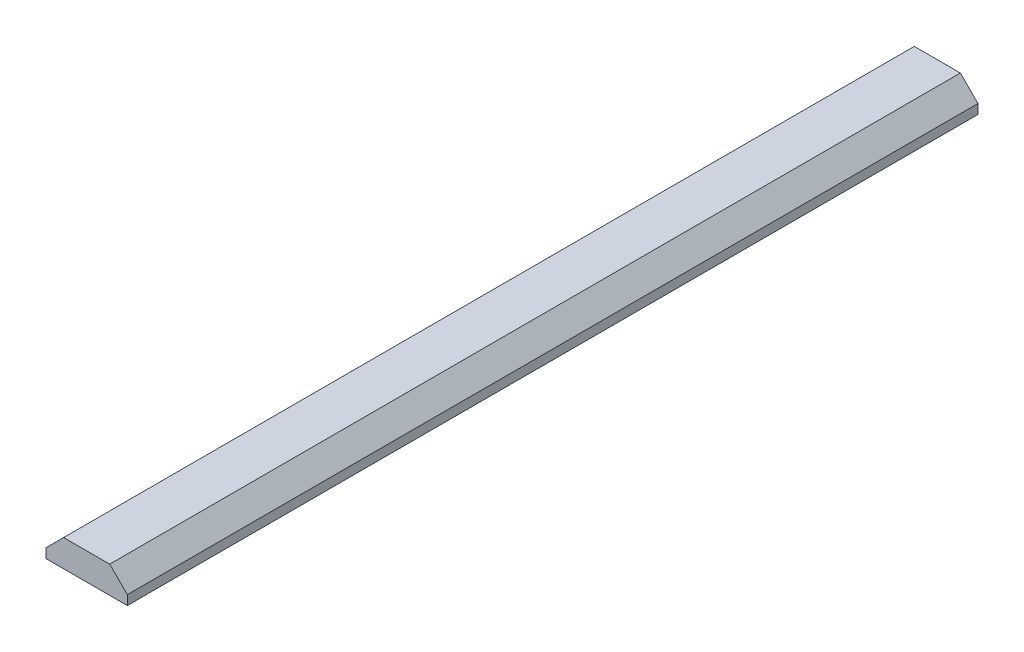
ISO-10303-21;
HEADER;
FILE_DESCRIPTION(('STEP AP214'),'2;1');
FILE_NAME('part.step','',(''),(''),'','','');
FILE_SCHEMA(('AUTOMOTIVE_DESIGN { 1 0 10303 214 1 1 1 1 }'));
ENDSEC;
DATA;
#1=APPLICATION_CONTEXT('core data for automotive mechanical design processes');
#2=APPLICATION_PROTOCOL_DEFINITION('international standard','automotive_design',2000,#1);
#3=PRODUCT_CONTEXT('',#1,'mechanical');
#4=PRODUCT('Part','Part','',(#3));
#5=PRODUCT_RELATED_PRODUCT_CATEGORY('part','',(#4));
#6=PRODUCT_DEFINITION_FORMATION('','',#4);
#7=PRODUCT_DEFINITION_CONTEXT('part definition',#1,'design');
#8=PRODUCT_DEFINITION('design','',#6,#7);
#9=PRODUCT_DEFINITION_SHAPE('','',#8);
#10=(LENGTH_UNIT() NAMED_UNIT(*) SI_UNIT(.MILLI.,.METRE.));
#11=(NAMED_UNIT(*) PLANE_ANGLE_UNIT() SI_UNIT($,.RADIAN.));
#12=(NAMED_UNIT(*) SI_UNIT($,.STERADIAN.) SOLID_ANGLE_UNIT());
#13=UNCERTAINTY_MEASURE_WITH_UNIT(LENGTH_MEASURE(1.E-05),#10,'distance_accuracy_value','');
#14=(GEOMETRIC_REPRESENTATION_CONTEXT(3) GLOBAL_UNCERTAINTY_ASSIGNED_CONTEXT((#13)) GLOBAL_UNIT_ASSIGNED_CONTEXT((#10,
#11,#12)) REPRESENTATION_CONTEXT('',''));
#15=CARTESIAN_POINT('',(0.,0.,0.));
#16=DIRECTION('',(0.,0.,1.));
#17=DIRECTION('',(1.,0.,0.));
#18=AXIS2_PLACEMENT_3D('',#15,#16,#17);
#19=CARTESIAN_POINT('',(3.4,1.80885878693797,125.5));
#20=DIRECTION('',(0.707106781186549,0.707106781186546,0.));
#21=DIRECTION('',(-0.707106781186546,0.707106781186549,0.));
#22=AXIS2_PLACEMENT_3D('',#19,#20,#21);
#23=PLANE('',#22);
#24=DIRECTION('',(0.707106781186546,-0.707106781186549,0.));
#25=VECTOR('',#24,1.);
#26=CARTESIAN_POINT('',(3.4,1.80885878693797,0.));
#27=LINE('',#26,#25);
#28=CARTESIAN_POINT('',(3.4,1.80885878693797,0.));
#29=VERTEX_POINT('',#28);
#30=CARTESIAN_POINT('',(6.,-0.791141213062042,0.));
#31=VERTEX_POINT('',#30);
#32=EDGE_CURVE('E127',#29,#31,#27,.T.);
#33=ORIENTED_EDGE('',*,*,#32,.F.);
#34=DIRECTION('',(0.,0.,-1.));
#35=VECTOR('',#34,1.);
#36=CARTESIAN_POINT('',(3.4,1.80885878693797,125.5));
#37=LINE('',#36,#35);
#38=CARTESIAN_POINT('',(3.4,1.80885878693797,125.5));
#39=VERTEX_POINT('',#38);
#40=EDGE_CURVE('E11',#39,#29,#37,.T.);
#41=ORIENTED_EDGE('',*,*,#40,.F.);
#42=DIRECTION('',(0.707106781186546,-0.707106781186549,0.));
#43=VECTOR('',#42,1.);
#44=CARTESIAN_POINT('',(3.4,1.80885878693797,125.5));
#45=LINE('',#44,#43);
#46=CARTESIAN_POINT('',(6.,-0.791141213062042,125.5));
#47=VERTEX_POINT('',#46);
#48=EDGE_CURVE('E139',#39,#47,#45,.T.);
#49=ORIENTED_EDGE('',*,*,#48,.T.);
#50=DIRECTION('',(0.,0.,-1.));
#51=VECTOR('',#50,1.);
#52=CARTESIAN_POINT('',(6.,-0.791141213062042,125.5));
#53=LINE('',#52,#51);
#54=EDGE_CURVE('E44',#47,#31,#53,.T.);
#55=ORIENTED_EDGE('',*,*,#54,.T.);
#56=EDGE_LOOP('',(#33,#41,#49,#55));
#57=FACE_BOUND('',#56,.T.);
#58=ADVANCED_FACE('F41',(#57),#23,.T.);
#59=CARTESIAN_POINT('',(3.4,1.80885878693797,125.5));
#60=DIRECTION('',(0.,-1.,0.));
#61=DIRECTION('',(0.,0.,-1.));
#62=AXIS2_PLACEMENT_3D('',#59,#60,#61);
#63=PLANE('',#62);
#64=DIRECTION('',(-1.,0.,0.));
#65=VECTOR('',#64,1.);
#66=CARTESIAN_POINT('',(3.4,1.80885878693797,0.));
#67=LINE('',#66,#65);
#68=CARTESIAN_POINT('',(-3.4,1.80885878693797,0.));
#69=VERTEX_POINT('',#68);
#70=EDGE_CURVE('E80',#29,#69,#67,.T.);
#71=ORIENTED_EDGE('',*,*,#70,.T.);
#72=DIRECTION('',(0.,0.,-1.));
#73=VECTOR('',#72,1.);
#74=CARTESIAN_POINT('',(-3.4,1.80885878693797,125.5));
#75=LINE('',#74,#73);
#76=CARTESIAN_POINT('',(-3.4,1.80885878693797,125.5));
#77=VERTEX_POINT('',#76);
#78=EDGE_CURVE('E50',#77,#69,#75,.T.);
#79=ORIENTED_EDGE('',*,*,#78,.F.);
#80=DIRECTION('',(-1.,0.,0.));
#81=VECTOR('',#80,1.);
#82=CARTESIAN_POINT('',(3.4,1.80885878693797,125.5));
#83=LINE('',#82,#81);
#84=EDGE_CURVE('E105',#39,#77,#83,.T.);
#85=ORIENTED_EDGE('',*,*,#84,.F.);
#86=ORIENTED_EDGE('',*,*,#40,.T.);
#87=EDGE_LOOP('',(#71,#79,#85,#86));
#88=FACE_BOUND('',#87,.T.);
#89=ADVANCED_FACE('F159',(#88),#63,.F.);
#90=CARTESIAN_POINT('',(-3.4,1.80885878693797,125.5));
#91=DIRECTION('',(0.707106781186549,-0.707106781186546,0.));
#92=DIRECTION('',(0.707106781186546,0.707106781186549,0.));
#93=AXIS2_PLACEMENT_3D('',#90,#91,#92);
#94=PLANE('',#93);
#95=DIRECTION('',(-0.707106781186546,-0.707106781186549,0.));
#96=VECTOR('',#95,1.);
#97=CARTESIAN_POINT('',(-3.4,1.80885878693797,0.));
#98=LINE('',#97,#96);
#99=CARTESIAN_POINT('',(-6.,-0.791141213062042,0.));
#100=VERTEX_POINT('',#99);
#101=EDGE_CURVE('E112',#69,#100,#98,.T.);
#102=ORIENTED_EDGE('',*,*,#101,.T.);
#103=DIRECTION('',(0.,0.,-1.));
#104=VECTOR('',#103,1.);
#105=CARTESIAN_POINT('',(-6.,-0.791141213062042,125.5));
#106=LINE('',#105,#104);
#107=CARTESIAN_POINT('',(-6.,-0.791141213062042,125.5));
#108=VERTEX_POINT('',#107);
#109=EDGE_CURVE('E109',#108,#100,#106,.T.);
#110=ORIENTED_EDGE('',*,*,#109,.F.);
#111=DIRECTION('',(-0.707106781186546,-0.707106781186549,0.));
#112=VECTOR('',#111,1.);
#113=CARTESIAN_POINT('',(-3.4,1.80885878693797,125.5));
#114=LINE('',#113,#112);
#115=EDGE_CURVE('E98',#77,#108,#114,.T.);
#116=ORIENTED_EDGE('',*,*,#115,.F.);
#117=ORIENTED_EDGE('',*,*,#78,.T.);
#118=EDGE_LOOP('',(#102,#110,#116,#117));
#119=FACE_BOUND('',#118,.T.);
#120=ADVANCED_FACE('F110',(#119),#94,.F.);
#121=CARTESIAN_POINT('',(-6.,-0.791141213062042,125.5));
#122=DIRECTION('',(1.,0.,0.));
#123=DIRECTION('',(0.,0.,-1.));
#124=AXIS2_PLACEMENT_3D('',#121,#122,#123);
#125=PLANE('',#124);
#126=DIRECTION('',(0.,-1.,0.));
#127=VECTOR('',#126,1.);
#128=CARTESIAN_POINT('',(-6.,-0.791141213062042,0.));
#129=LINE('',#128,#127);
#130=CARTESIAN_POINT('',(-6.,-2.19114121306203,0.));
#131=VERTEX_POINT('',#130);
#132=EDGE_CURVE('E136',#100,#131,#129,.T.);
#133=ORIENTED_EDGE('',*,*,#132,.T.);
#134=DIRECTION('',(0.,0.,-1.));
#135=VECTOR('',#134,1.);
#136=CARTESIAN_POINT('',(-6.,-2.19114121306203,125.5));
#137=LINE('',#136,#135);
#138=CARTESIAN_POINT('',(-6.,-2.19114121306203,125.5));
#139=VERTEX_POINT('',#138);
#140=EDGE_CURVE('E115',#139,#131,#137,.T.);
#141=ORIENTED_EDGE('',*,*,#140,.F.);
#142=DIRECTION('',(0.,-1.,0.));
#143=VECTOR('',#142,1.);
#144=CARTESIAN_POINT('',(-6.,-0.791141213062042,125.5));
#145=LINE('',#144,#143);
#146=EDGE_CURVE('E103',#108,#139,#145,.T.);
#147=ORIENTED_EDGE('',*,*,#146,.F.);
#148=ORIENTED_EDGE('',*,*,#109,.T.);
#149=EDGE_LOOP('',(#133,#141,#147,#148));
#150=FACE_BOUND('',#149,.T.);
#151=ADVANCED_FACE('F117',(#150),#125,.F.);
#152=CARTESIAN_POINT('',(-6.,-2.19114121306203,125.5));
#153=DIRECTION('',(0.,1.,0.));
#154=DIRECTION('',(0.,0.,1.));
#155=AXIS2_PLACEMENT_3D('',#152,#153,#154);
#156=PLANE('',#155);
#157=DIRECTION('',(1.,0.,0.));
#158=VECTOR('',#157,1.);
#159=CARTESIAN_POINT('',(-6.,-2.19114121306203,0.));
#160=LINE('',#159,#158);
#161=CARTESIAN_POINT('',(6.,-2.19114121306203,0.));
#162=VERTEX_POINT('',#161);
#163=EDGE_CURVE('E133',#131,#162,#160,.T.);
#164=ORIENTED_EDGE('',*,*,#163,.T.);
#165=DIRECTION('',(0.,0.,-1.));
#166=VECTOR('',#165,1.);
#167=CARTESIAN_POINT('',(6.,-2.19114121306203,125.5));
#168=LINE('',#167,#166);
#169=CARTESIAN_POINT('',(6.,-2.19114121306203,125.5));
#170=VERTEX_POINT('',#169);
#171=EDGE_CURVE('E142',#170,#162,#168,.T.);
#172=ORIENTED_EDGE('',*,*,#171,.F.);
#173=DIRECTION('',(1.,0.,0.));
#174=VECTOR('',#173,1.);
#175=CARTESIAN_POINT('',(-6.,-2.19114121306203,125.5));
#176=LINE('',#175,#174);
#177=EDGE_CURVE('E120',#139,#170,#176,.T.);
#178=ORIENTED_EDGE('',*,*,#177,.F.);
#179=ORIENTED_EDGE('',*,*,#140,.T.);
#180=EDGE_LOOP('',(#164,#172,#178,#179));
#181=FACE_BOUND('',#180,.T.);
#182=ADVANCED_FACE('F149',(#181),#156,.F.);
#183=CARTESIAN_POINT('',(6.,-0.791141213062042,125.5));
#184=DIRECTION('',(1.,0.,0.));
#185=DIRECTION('',(0.,0.,-1.));
#186=AXIS2_PLACEMENT_3D('',#183,#184,#185);
#187=PLANE('',#186);
#188=DIRECTION('',(0.,-1.,0.));
#189=VECTOR('',#188,1.);
#190=CARTESIAN_POINT('',(6.,-0.791141213062042,0.));
#191=LINE('',#190,#189);
#192=EDGE_CURVE('E130',#31,#162,#191,.T.);
#193=ORIENTED_EDGE('',*,*,#192,.F.);
#194=ORIENTED_EDGE('',*,*,#54,.F.);
#195=DIRECTION('',(0.,-1.,0.));
#196=VECTOR('',#195,1.);
#197=CARTESIAN_POINT('',(6.,-0.791141213062042,125.5));
#198=LINE('',#197,#196);
#199=EDGE_CURVE('E122',#47,#170,#198,.T.);
#200=ORIENTED_EDGE('',*,*,#199,.T.);
#201=ORIENTED_EDGE('',*,*,#171,.T.);
#202=EDGE_LOOP('',(#193,#194,#200,#201));
#203=FACE_BOUND('',#202,.T.);
#204=ADVANCED_FACE('F144',(#203),#187,.T.);
#205=CARTESIAN_POINT('',(0.,0.,125.5));
#206=DIRECTION('',(0.,0.,-1.));
#207=DIRECTION('',(-1.,0.,0.));
#208=AXIS2_PLACEMENT_3D('',#205,#206,#207);
#209=PLANE('',#208);
#210=ORIENTED_EDGE('',*,*,#48,.F.);
#211=ORIENTED_EDGE('',*,*,#84,.T.);
#212=ORIENTED_EDGE('',*,*,#115,.T.);
#213=ORIENTED_EDGE('',*,*,#146,.T.);
#214=ORIENTED_EDGE('',*,*,#177,.T.);
#215=ORIENTED_EDGE('',*,*,#199,.F.);
#216=EDGE_LOOP('',(#210,#211,#212,#213,#214,#215));
#217=FACE_BOUND('',#216,.T.);
#218=ADVANCED_FACE('F101',(#217),#209,.F.);
#219=CARTESIAN_POINT('',(0.,0.,0.));
#220=DIRECTION('',(0.,0.,-1.));
#221=DIRECTION('',(-1.,0.,0.));
#222=AXIS2_PLACEMENT_3D('',#219,#220,#221);
#223=PLANE('',#222);
#224=ORIENTED_EDGE('',*,*,#32,.T.);
#225=ORIENTED_EDGE('',*,*,#192,.T.);
#226=ORIENTED_EDGE('',*,*,#163,.F.);
#227=ORIENTED_EDGE('',*,*,#132,.F.);
#228=ORIENTED_EDGE('',*,*,#101,.F.);
#229=ORIENTED_EDGE('',*,*,#70,.F.);
#230=EDGE_LOOP('',(#224,#225,#226,#227,#228,#229));
#231=FACE_BOUND('',#230,.T.);
#232=ADVANCED_FACE('F147',(#231),#223,.T.);
#233=CLOSED_SHELL('',(#58,#89,#120,#151,#182,#204,#218,#232));
#234=MANIFOLD_SOLID_BREP('B2',#233);
#235=ADVANCED_BREP_SHAPE_REPRESENTATION('',(#18,#234),#14);
#236=SHAPE_DEFINITION_REPRESENTATION(#9,#235);
ENDSEC;
END-ISO-10303-21;
